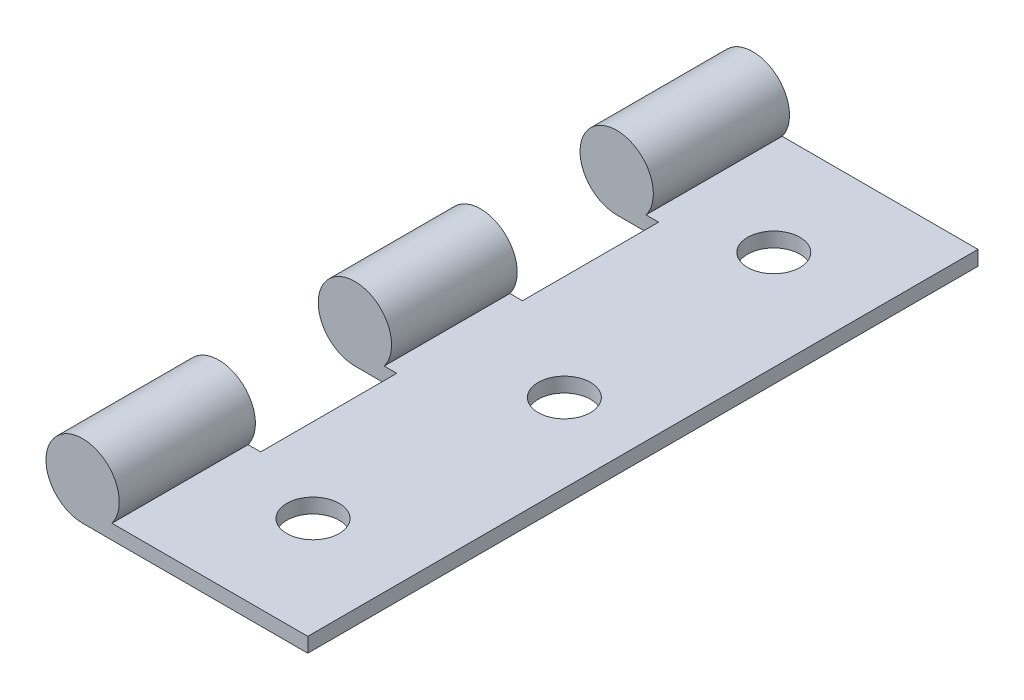
ISO-10303-21;
HEADER;
FILE_DESCRIPTION(('STEP AP214'),'2;1');
FILE_NAME('part.step','',(''),(''),'','','');
FILE_SCHEMA(('AUTOMOTIVE_DESIGN { 1 0 10303 214 1 1 1 1 }'));
ENDSEC;
DATA;
#1=APPLICATION_CONTEXT('core data for automotive mechanical design processes');
#2=APPLICATION_PROTOCOL_DEFINITION('international standard','automotive_design',2000,#1);
#3=PRODUCT_CONTEXT('',#1,'mechanical');
#4=PRODUCT('Part','Part','',(#3));
#5=PRODUCT_RELATED_PRODUCT_CATEGORY('part','',(#4));
#6=PRODUCT_DEFINITION_FORMATION('','',#4);
#7=PRODUCT_DEFINITION_CONTEXT('part definition',#1,'design');
#8=PRODUCT_DEFINITION('design','',#6,#7);
#9=PRODUCT_DEFINITION_SHAPE('','',#8);
#10=(LENGTH_UNIT() NAMED_UNIT(*) SI_UNIT(.MILLI.,.METRE.));
#11=(NAMED_UNIT(*) PLANE_ANGLE_UNIT() SI_UNIT($,.RADIAN.));
#12=(NAMED_UNIT(*) SI_UNIT($,.STERADIAN.) SOLID_ANGLE_UNIT());
#13=UNCERTAINTY_MEASURE_WITH_UNIT(LENGTH_MEASURE(1.E-05),#10,'distance_accuracy_value','');
#14=(GEOMETRIC_REPRESENTATION_CONTEXT(3) GLOBAL_UNCERTAINTY_ASSIGNED_CONTEXT((#13)) GLOBAL_UNIT_ASSIGNED_CONTEXT((#10,
#11,#12)) REPRESENTATION_CONTEXT('',''));
#15=CARTESIAN_POINT('',(0.,0.,0.));
#16=DIRECTION('',(0.,0.,1.));
#17=DIRECTION('',(1.,0.,0.));
#18=AXIS2_PLACEMENT_3D('',#15,#16,#17);
#19=CARTESIAN_POINT('',(0.,0.,64.));
#20=DIRECTION('',(0.,1.,0.));
#21=DIRECTION('',(0.,0.,1.));
#22=AXIS2_PLACEMENT_3D('',#19,#20,#21);
#23=PLANE('',#22);
#24=CARTESIAN_POINT('',(11.999999876,0.,53.99999995));
#25=DIRECTION('',(0.,1.,0.));
#26=DIRECTION('',(0.,0.,1.));
#27=AXIS2_PLACEMENT_3D('',#24,#25,#26);
#28=CIRCLE('',#27,2.49999995299997);
#29=CARTESIAN_POINT('',(11.999999876,0.,51.499999997));
#30=VERTEX_POINT('',#29);
#31=EDGE_CURVE('E173',#30,#30,#28,.T.);
#32=ORIENTED_EDGE('',*,*,#31,.T.);
#33=EDGE_LOOP('',(#32));
#34=FACE_BOUND('',#33,.T.);
#35=CARTESIAN_POINT('',(13.999999876,0.,32.000000008));
#36=DIRECTION('',(0.,1.,0.));
#37=DIRECTION('',(0.,0.,1.));
#38=AXIS2_PLACEMENT_3D('',#35,#36,#37);
#39=CIRCLE('',#38,2.49999995299996);
#40=CARTESIAN_POINT('',(13.999999876,0.,29.500000055));
#41=VERTEX_POINT('',#40);
#42=EDGE_CURVE('E169',#41,#41,#39,.T.);
#43=ORIENTED_EDGE('',*,*,#42,.T.);
#44=EDGE_LOOP('',(#43));
#45=FACE_BOUND('',#44,.T.);
#46=CARTESIAN_POINT('',(11.999999876,0.,10.000000066));
#47=DIRECTION('',(0.,1.,0.));
#48=DIRECTION('',(0.,0.,1.));
#49=AXIS2_PLACEMENT_3D('',#46,#47,#48);
#50=CIRCLE('',#49,2.49999995299997);
#51=CARTESIAN_POINT('',(11.999999876,0.,7.50000011300003));
#52=VERTEX_POINT('',#51);
#53=EDGE_CURVE('E165',#52,#52,#50,.T.);
#54=ORIENTED_EDGE('',*,*,#53,.T.);
#55=EDGE_LOOP('',(#54));
#56=FACE_BOUND('',#55,.T.);
#57=DIRECTION('',(-1.,0.,0.));
#58=VECTOR('',#57,1.);
#59=CARTESIAN_POINT('',(-4.,0.,37.999999908));
#60=LINE('',#59,#58);
#61=CARTESIAN_POINT('',(4.000000002,0.,37.999999908));
#62=VERTEX_POINT('',#61);
#63=CARTESIAN_POINT('',(0.,0.,37.999999908));
#64=VERTEX_POINT('',#63);
#65=EDGE_CURVE('E137',#62,#64,#60,.T.);
#66=ORIENTED_EDGE('',*,*,#65,.T.);
#67=DIRECTION('',(0.,0.,-1.));
#68=VECTOR('',#67,1.);
#69=CARTESIAN_POINT('',(0.,0.,64.));
#70=LINE('',#69,#68);
#71=CARTESIAN_POINT('',(0.,0.,25.999999908));
#72=VERTEX_POINT('',#71);
#73=EDGE_CURVE('E58',#64,#72,#70,.T.);
#74=ORIENTED_EDGE('',*,*,#73,.T.);
#75=DIRECTION('',(1.,0.,0.));
#76=VECTOR('',#75,1.);
#77=CARTESIAN_POINT('',(-4.,0.,25.999999908));
#78=LINE('',#77,#76);
#79=CARTESIAN_POINT('',(4.000000002,0.,25.999999908));
#80=VERTEX_POINT('',#79);
#81=EDGE_CURVE('E155',#72,#80,#78,.T.);
#82=ORIENTED_EDGE('',*,*,#81,.T.);
#83=DIRECTION('',(0.,0.,-1.));
#84=VECTOR('',#83,1.);
#85=CARTESIAN_POINT('',(4.000000002,0.,25.999999908));
#86=LINE('',#85,#84);
#87=CARTESIAN_POINT('',(4.000000002,0.,12.999999908));
#88=VERTEX_POINT('',#87);
#89=EDGE_CURVE('E149',#80,#88,#86,.T.);
#90=ORIENTED_EDGE('',*,*,#89,.T.);
#91=DIRECTION('',(-1.,0.,0.));
#92=VECTOR('',#91,1.);
#93=CARTESIAN_POINT('',(-4.,0.,12.999999908));
#94=LINE('',#93,#92);
#95=CARTESIAN_POINT('',(0.,0.,12.999999908));
#96=VERTEX_POINT('',#95);
#97=EDGE_CURVE('E152',#88,#96,#94,.T.);
#98=ORIENTED_EDGE('',*,*,#97,.T.);
#99=CARTESIAN_POINT('',(0.,0.,0.));
#100=VERTEX_POINT('',#99);
#101=EDGE_CURVE('E207',#96,#100,#70,.T.);
#102=ORIENTED_EDGE('',*,*,#101,.T.);
#103=DIRECTION('',(1.,0.,0.));
#104=VECTOR('',#103,1.);
#105=CARTESIAN_POINT('',(0.,0.,0.));
#106=LINE('',#105,#104);
#107=CARTESIAN_POINT('',(21.499999926,0.,0.));
#108=VERTEX_POINT('',#107);
#109=EDGE_CURVE('E191',#100,#108,#106,.T.);
#110=ORIENTED_EDGE('',*,*,#109,.T.);
#111=DIRECTION('',(0.,0.,-1.));
#112=VECTOR('',#111,1.);
#113=CARTESIAN_POINT('',(21.499999926,0.,64.));
#114=LINE('',#113,#112);
#115=CARTESIAN_POINT('',(21.499999926,0.,64.));
#116=VERTEX_POINT('',#115);
#117=EDGE_CURVE('E204',#116,#108,#114,.T.);
#118=ORIENTED_EDGE('',*,*,#117,.F.);
#119=DIRECTION('',(1.,0.,0.));
#120=VECTOR('',#119,1.);
#121=CARTESIAN_POINT('',(0.,0.,64.));
#122=LINE('',#121,#120);
#123=CARTESIAN_POINT('',(0.,0.,64.));
#124=VERTEX_POINT('',#123);
#125=EDGE_CURVE('E180',#124,#116,#122,.T.);
#126=ORIENTED_EDGE('',*,*,#125,.F.);
#127=CARTESIAN_POINT('',(0.,0.,50.999999908));
#128=VERTEX_POINT('',#127);
#129=EDGE_CURVE('E208',#124,#128,#70,.T.);
#130=ORIENTED_EDGE('',*,*,#129,.T.);
#131=DIRECTION('',(1.,0.,0.));
#132=VECTOR('',#131,1.);
#133=CARTESIAN_POINT('',(-4.,0.,50.999999908));
#134=LINE('',#133,#132);
#135=CARTESIAN_POINT('',(4.000000002,0.,50.999999908));
#136=VERTEX_POINT('',#135);
#137=EDGE_CURVE('E50',#128,#136,#134,.T.);
#138=ORIENTED_EDGE('',*,*,#137,.T.);
#139=DIRECTION('',(0.,0.,-1.));
#140=VECTOR('',#139,1.);
#141=CARTESIAN_POINT('',(4.000000002,0.,37.999999908));
#142=LINE('',#141,#140);
#143=EDGE_CURVE('E130',#136,#62,#142,.T.);
#144=ORIENTED_EDGE('',*,*,#143,.T.);
#145=EDGE_LOOP('',(#66,#74,#82,#90,#98,#102,#110,#118,#126,#130,#138,#144));
#146=FACE_BOUND('',#145,.T.);
#147=ADVANCED_FACE('F35',(#34,#45,#56,#146),#23,.F.);
#148=CARTESIAN_POINT('',(2.7999999925,1.4,64.));
#149=DIRECTION('',(0.,-1.,0.));
#150=DIRECTION('',(1.,0.,0.));
#151=AXIS2_PLACEMENT_3D('',#148,#149,#150);
#152=PLANE('',#151);
#153=CARTESIAN_POINT('',(11.999999876,1.4,53.99999995));
#154=DIRECTION('',(0.,-1.,0.));
#155=DIRECTION('',(1.,0.,0.));
#156=AXIS2_PLACEMENT_3D('',#153,#154,#155);
#157=CIRCLE('',#156,2.49999995299997);
#158=CARTESIAN_POINT('',(11.999999876,1.4,51.499999997));
#159=VERTEX_POINT('',#158);
#160=EDGE_CURVE('E176',#159,#159,#157,.F.);
#161=ORIENTED_EDGE('',*,*,#160,.F.);
#162=EDGE_LOOP('',(#161));
#163=FACE_BOUND('',#162,.T.);
#164=CARTESIAN_POINT('',(13.999999876,1.4,32.000000008));
#165=DIRECTION('',(0.,-1.,0.));
#166=DIRECTION('',(1.,0.,0.));
#167=AXIS2_PLACEMENT_3D('',#164,#165,#166);
#168=CIRCLE('',#167,2.49999995299996);
#169=CARTESIAN_POINT('',(13.999999876,1.4,29.500000055));
#170=VERTEX_POINT('',#169);
#171=EDGE_CURVE('E172',#170,#170,#168,.F.);
#172=ORIENTED_EDGE('',*,*,#171,.F.);
#173=EDGE_LOOP('',(#172));
#174=FACE_BOUND('',#173,.T.);
#175=CARTESIAN_POINT('',(11.999999876,1.4,10.000000066));
#176=DIRECTION('',(0.,-1.,0.));
#177=DIRECTION('',(1.,0.,0.));
#178=AXIS2_PLACEMENT_3D('',#175,#176,#177);
#179=CIRCLE('',#178,2.49999995299997);
#180=CARTESIAN_POINT('',(11.999999876,1.4,7.50000011300003));
#181=VERTEX_POINT('',#180);
#182=EDGE_CURVE('E168',#181,#181,#179,.F.);
#183=ORIENTED_EDGE('',*,*,#182,.F.);
#184=EDGE_LOOP('',(#183));
#185=FACE_BOUND('',#184,.T.);
#186=DIRECTION('',(-1.,0.,0.));
#187=VECTOR('',#186,1.);
#188=CARTESIAN_POINT('',(2.7999999925,1.4,37.999999908));
#189=LINE('',#188,#187);
#190=CARTESIAN_POINT('',(4.000000002,1.4,37.999999908));
#191=VERTEX_POINT('',#190);
#192=CARTESIAN_POINT('',(2.7999999925,1.4,37.999999908));
#193=VERTEX_POINT('',#192);
#194=EDGE_CURVE('E147',#191,#193,#189,.T.);
#195=ORIENTED_EDGE('',*,*,#194,.F.);
#196=DIRECTION('',(0.,0.,-1.));
#197=VECTOR('',#196,1.);
#198=CARTESIAN_POINT('',(4.000000002,1.4,64.));
#199=LINE('',#198,#197);
#200=CARTESIAN_POINT('',(4.000000002,1.4,50.999999908));
#201=VERTEX_POINT('',#200);
#202=EDGE_CURVE('E11',#201,#191,#199,.T.);
#203=ORIENTED_EDGE('',*,*,#202,.F.);
#204=DIRECTION('',(1.,0.,0.));
#205=VECTOR('',#204,1.);
#206=CARTESIAN_POINT('',(2.79999999250001,1.4,50.999999908));
#207=LINE('',#206,#205);
#208=CARTESIAN_POINT('',(2.7999999925,1.4,50.999999908));
#209=VERTEX_POINT('',#208);
#210=EDGE_CURVE('E134',#209,#201,#207,.T.);
#211=ORIENTED_EDGE('',*,*,#210,.F.);
#212=DIRECTION('',(0.,0.,-1.));
#213=VECTOR('',#212,1.);
#214=CARTESIAN_POINT('',(2.7999999925,1.4,64.));
#215=LINE('',#214,#213);
#216=CARTESIAN_POINT('',(2.7999999925,1.4,64.));
#217=VERTEX_POINT('',#216);
#218=EDGE_CURVE('E197',#217,#209,#215,.T.);
#219=ORIENTED_EDGE('',*,*,#218,.F.);
#220=DIRECTION('',(-1.,0.,0.));
#221=VECTOR('',#220,1.);
#222=CARTESIAN_POINT('',(2.7999999925,1.4,64.));
#223=LINE('',#222,#221);
#224=CARTESIAN_POINT('',(21.499999926,1.4,64.));
#225=VERTEX_POINT('',#224);
#226=EDGE_CURVE('E185',#225,#217,#223,.T.);
#227=ORIENTED_EDGE('',*,*,#226,.F.);
#228=DIRECTION('',(0.,0.,-1.));
#229=VECTOR('',#228,1.);
#230=CARTESIAN_POINT('',(21.499999926,1.4,64.));
#231=LINE('',#230,#229);
#232=CARTESIAN_POINT('',(21.499999926,1.4,0.));
#233=VERTEX_POINT('',#232);
#234=EDGE_CURVE('E200',#225,#233,#231,.T.);
#235=ORIENTED_EDGE('',*,*,#234,.T.);
#236=DIRECTION('',(-1.,0.,0.));
#237=VECTOR('',#236,1.);
#238=CARTESIAN_POINT('',(2.7999999925,1.4,0.));
#239=LINE('',#238,#237);
#240=CARTESIAN_POINT('',(2.7999999925,1.4,0.));
#241=VERTEX_POINT('',#240);
#242=EDGE_CURVE('E181',#233,#241,#239,.T.);
#243=ORIENTED_EDGE('',*,*,#242,.T.);
#244=CARTESIAN_POINT('',(2.7999999925,1.4,12.999999908));
#245=VERTEX_POINT('',#244);
#246=EDGE_CURVE('E187',#245,#241,#215,.T.);
#247=ORIENTED_EDGE('',*,*,#246,.F.);
#248=DIRECTION('',(-1.,0.,0.));
#249=VECTOR('',#248,1.);
#250=CARTESIAN_POINT('',(2.7999999925,1.4,12.999999908));
#251=LINE('',#250,#249);
#252=CARTESIAN_POINT('',(4.000000002,1.4,12.999999908));
#253=VERTEX_POINT('',#252);
#254=EDGE_CURVE('E163',#253,#245,#251,.T.);
#255=ORIENTED_EDGE('',*,*,#254,.F.);
#256=DIRECTION('',(0.,0.,-1.));
#257=VECTOR('',#256,1.);
#258=CARTESIAN_POINT('',(4.000000002,1.4,64.));
#259=LINE('',#258,#257);
#260=CARTESIAN_POINT('',(4.000000002,1.4,25.999999908));
#261=VERTEX_POINT('',#260);
#262=EDGE_CURVE('E221',#261,#253,#259,.T.);
#263=ORIENTED_EDGE('',*,*,#262,.F.);
#264=DIRECTION('',(1.,0.,0.));
#265=VECTOR('',#264,1.);
#266=CARTESIAN_POINT('',(2.7999999925,1.4,25.999999908));
#267=LINE('',#266,#265);
#268=CARTESIAN_POINT('',(2.7999999925,1.4,25.999999908));
#269=VERTEX_POINT('',#268);
#270=EDGE_CURVE('E161',#269,#261,#267,.T.);
#271=ORIENTED_EDGE('',*,*,#270,.F.);
#272=EDGE_CURVE('E201',#193,#269,#215,.T.);
#273=ORIENTED_EDGE('',*,*,#272,.F.);
#274=EDGE_LOOP('',(#195,#203,#211,#219,#227,#235,#243,#247,#255,#263,#271,#273));
#275=FACE_BOUND('',#274,.T.);
#276=ADVANCED_FACE('F230',(#163,#174,#185,#275),#152,.F.);
#277=CARTESIAN_POINT('',(0.,3.499999985,64.));
#278=DIRECTION('',(0.,0.,-1.));
#279=DIRECTION('',(-1.,0.,0.));
#280=AXIS2_PLACEMENT_3D('',#277,#278,#279);
#281=CYLINDRICAL_SURFACE('',#280,3.499999985);
#282=CARTESIAN_POINT('',(0.,3.499999985,37.999999908));
#283=DIRECTION('',(0.,0.,1.));
#284=DIRECTION('',(1.,0.,0.));
#285=AXIS2_PLACEMENT_3D('',#282,#283,#284);
#286=CIRCLE('',#285,3.499999985);
#287=EDGE_CURVE('E43',#193,#64,#286,.T.);
#288=ORIENTED_EDGE('',*,*,#287,.F.);
#289=ORIENTED_EDGE('',*,*,#272,.T.);
#290=CARTESIAN_POINT('',(0.,3.499999985,25.999999908));
#291=DIRECTION('',(0.,0.,-1.));
#292=DIRECTION('',(-1.,0.,0.));
#293=AXIS2_PLACEMENT_3D('',#290,#291,#292);
#294=CIRCLE('',#293,3.499999985);
#295=EDGE_CURVE('E210',#72,#269,#294,.T.);
#296=ORIENTED_EDGE('',*,*,#295,.F.);
#297=ORIENTED_EDGE('',*,*,#73,.F.);
#298=EDGE_LOOP('',(#288,#289,#296,#297));
#299=FACE_BOUND('',#298,.T.);
#300=ADVANCED_FACE('F254',(#299),#281,.T.);
#301=CARTESIAN_POINT('',(0.,3.499999985,50.999999908));
#302=DIRECTION('',(0.,0.,-1.));
#303=DIRECTION('',(-1.,0.,0.));
#304=AXIS2_PLACEMENT_3D('',#301,#302,#303);
#305=CIRCLE('',#304,3.499999985);
#306=EDGE_CURVE('E223',#128,#209,#305,.T.);
#307=ORIENTED_EDGE('',*,*,#306,.F.);
#308=ORIENTED_EDGE('',*,*,#129,.F.);
#309=CARTESIAN_POINT('',(0.,3.499999985,64.));
#310=DIRECTION('',(0.,0.,1.));
#311=DIRECTION('',(1.,0.,0.));
#312=AXIS2_PLACEMENT_3D('',#309,#310,#311);
#313=CIRCLE('',#312,3.499999985);
#314=EDGE_CURVE('E177',#217,#124,#313,.T.);
#315=ORIENTED_EDGE('',*,*,#314,.F.);
#316=ORIENTED_EDGE('',*,*,#218,.T.);
#317=EDGE_LOOP('',(#307,#308,#315,#316));
#318=FACE_BOUND('',#317,.T.);
#319=ADVANCED_FACE('F233',(#318),#281,.T.);
#320=CARTESIAN_POINT('',(0.,3.499999985,12.999999908));
#321=DIRECTION('',(0.,0.,1.));
#322=DIRECTION('',(1.,0.,0.));
#323=AXIS2_PLACEMENT_3D('',#320,#321,#322);
#324=CIRCLE('',#323,3.499999985);
#325=EDGE_CURVE('E219',#245,#96,#324,.T.);
#326=ORIENTED_EDGE('',*,*,#325,.F.);
#327=ORIENTED_EDGE('',*,*,#246,.T.);
#328=CARTESIAN_POINT('',(0.,3.499999985,0.));
#329=DIRECTION('',(0.,0.,1.));
#330=DIRECTION('',(1.,0.,0.));
#331=AXIS2_PLACEMENT_3D('',#328,#329,#330);
#332=CIRCLE('',#331,3.499999985);
#333=EDGE_CURVE('E188',#241,#100,#332,.T.);
#334=ORIENTED_EDGE('',*,*,#333,.T.);
#335=ORIENTED_EDGE('',*,*,#101,.F.);
#336=EDGE_LOOP('',(#326,#327,#334,#335));
#337=FACE_BOUND('',#336,.T.);
#338=ADVANCED_FACE('F37',(#337),#281,.T.);
#339=CARTESIAN_POINT('',(21.499999926,0.,64.));
#340=DIRECTION('',(-1.,0.,0.));
#341=DIRECTION('',(0.,0.,1.));
#342=AXIS2_PLACEMENT_3D('',#339,#340,#341);
#343=PLANE('',#342);
#344=DIRECTION('',(0.,1.,0.));
#345=VECTOR('',#344,1.);
#346=CARTESIAN_POINT('',(21.499999926,0.,0.));
#347=LINE('',#346,#345);
#348=EDGE_CURVE('E193',#108,#233,#347,.T.);
#349=ORIENTED_EDGE('',*,*,#348,.T.);
#350=ORIENTED_EDGE('',*,*,#234,.F.);
#351=DIRECTION('',(0.,1.,0.));
#352=VECTOR('',#351,1.);
#353=CARTESIAN_POINT('',(21.499999926,0.,64.));
#354=LINE('',#353,#352);
#355=EDGE_CURVE('E183',#116,#225,#354,.T.);
#356=ORIENTED_EDGE('',*,*,#355,.F.);
#357=ORIENTED_EDGE('',*,*,#117,.T.);
#358=EDGE_LOOP('',(#349,#350,#356,#357));
#359=FACE_BOUND('',#358,.T.);
#360=ADVANCED_FACE('F267',(#359),#343,.F.);
#361=CARTESIAN_POINT('',(0.,3.499999985,64.));
#362=DIRECTION('',(0.,0.,1.));
#363=DIRECTION('',(1.,0.,0.));
#364=AXIS2_PLACEMENT_3D('',#361,#362,#363);
#365=PLANE('',#364);
#366=ORIENTED_EDGE('',*,*,#314,.T.);
#367=ORIENTED_EDGE('',*,*,#125,.T.);
#368=ORIENTED_EDGE('',*,*,#355,.T.);
#369=ORIENTED_EDGE('',*,*,#226,.T.);
#370=EDGE_LOOP('',(#366,#367,#368,#369));
#371=FACE_BOUND('',#370,.T.);
#372=ADVANCED_FACE('F235',(#371),#365,.T.);
#373=CARTESIAN_POINT('',(0.,3.499999985,0.));
#374=DIRECTION('',(0.,0.,1.));
#375=DIRECTION('',(1.,0.,0.));
#376=AXIS2_PLACEMENT_3D('',#373,#374,#375);
#377=PLANE('',#376);
#378=ORIENTED_EDGE('',*,*,#333,.F.);
#379=ORIENTED_EDGE('',*,*,#242,.F.);
#380=ORIENTED_EDGE('',*,*,#348,.F.);
#381=ORIENTED_EDGE('',*,*,#109,.F.);
#382=EDGE_LOOP('',(#378,#379,#380,#381));
#383=FACE_BOUND('',#382,.T.);
#384=ADVANCED_FACE('F245',(#383),#377,.F.);
#385=CARTESIAN_POINT('',(11.999999876,4.99999999999999,53.99999995));
#386=DIRECTION('',(0.,-1.,0.));
#387=DIRECTION('',(0.,0.,-1.));
#388=AXIS2_PLACEMENT_3D('',#385,#386,#387);
#389=CYLINDRICAL_SURFACE('',#388,2.49999995299997);
#390=CARTESIAN_POINT('',(11.999999876,0.,51.499999997));
#391=CARTESIAN_POINT('',(11.999999876,0.0145833333333326,51.499999997));
#392=CARTESIAN_POINT('',(11.999999876,0.0291666666666661,51.499999997));
#393=CARTESIAN_POINT('',(11.999999876,0.0583333333333327,51.499999997));
#394=CARTESIAN_POINT('',(11.999999876,0.0729166666666659,51.499999997));
#395=CARTESIAN_POINT('',(11.999999876,0.102083333333332,51.499999997));
#396=CARTESIAN_POINT('',(11.999999876,0.116666666666666,51.499999997));
#397=CARTESIAN_POINT('',(11.999999876,0.145833333333333,51.499999997));
#398=CARTESIAN_POINT('',(11.999999876,0.160416666666666,51.499999997));
#399=CARTESIAN_POINT('',(11.999999876,0.189583333333332,51.499999997));
#400=CARTESIAN_POINT('',(11.999999876,0.204166666666666,51.499999997));
#401=CARTESIAN_POINT('',(11.999999876,0.233333333333333,51.499999997));
#402=CARTESIAN_POINT('',(11.999999876,0.247916666666666,51.499999997));
#403=CARTESIAN_POINT('',(11.999999876,0.277083333333333,51.499999997));
#404=CARTESIAN_POINT('',(11.999999876,0.291666666666666,51.499999997));
#405=CARTESIAN_POINT('',(11.999999876,0.320833333333333,51.499999997));
#406=CARTESIAN_POINT('',(11.999999876,0.335416666666666,51.499999997));
#407=CARTESIAN_POINT('',(11.999999876,0.364583333333333,51.499999997));
#408=CARTESIAN_POINT('',(11.999999876,0.379166666666667,51.499999997));
#409=CARTESIAN_POINT('',(11.999999876,0.408333333333333,51.499999997));
#410=CARTESIAN_POINT('',(11.999999876,0.422916666666666,51.499999997));
#411=CARTESIAN_POINT('',(11.999999876,0.452083333333333,51.499999997));
#412=CARTESIAN_POINT('',(11.999999876,0.466666666666666,51.499999997));
#413=CARTESIAN_POINT('',(11.999999876,0.495833333333333,51.499999997));
#414=CARTESIAN_POINT('',(11.999999876,0.510416666666667,51.499999997));
#415=CARTESIAN_POINT('',(11.999999876,0.539583333333333,51.499999997));
#416=CARTESIAN_POINT('',(11.999999876,0.554166666666667,51.499999997));
#417=CARTESIAN_POINT('',(11.999999876,0.583333333333333,51.499999997));
#418=CARTESIAN_POINT('',(11.999999876,0.597916666666667,51.499999997));
#419=CARTESIAN_POINT('',(11.999999876,0.627083333333333,51.499999997));
#420=CARTESIAN_POINT('',(11.999999876,0.641666666666667,51.499999997));
#421=CARTESIAN_POINT('',(11.999999876,0.670833333333333,51.499999997));
#422=CARTESIAN_POINT('',(11.999999876,0.685416666666667,51.499999997));
#423=CARTESIAN_POINT('',(11.999999876,0.714583333333334,51.499999997));
#424=CARTESIAN_POINT('',(11.999999876,0.729166666666667,51.499999997));
#425=CARTESIAN_POINT('',(11.999999876,0.758333333333334,51.499999997));
#426=CARTESIAN_POINT('',(11.999999876,0.772916666666667,51.499999997));
#427=CARTESIAN_POINT('',(11.999999876,0.802083333333333,51.499999997));
#428=CARTESIAN_POINT('',(11.999999876,0.816666666666667,51.499999997));
#429=CARTESIAN_POINT('',(11.999999876,0.845833333333334,51.499999997));
#430=CARTESIAN_POINT('',(11.999999876,0.860416666666667,51.499999997));
#431=CARTESIAN_POINT('',(11.999999876,0.889583333333333,51.499999997));
#432=CARTESIAN_POINT('',(11.999999876,0.904166666666667,51.499999997));
#433=CARTESIAN_POINT('',(11.999999876,0.933333333333334,51.499999997));
#434=CARTESIAN_POINT('',(11.999999876,0.947916666666667,51.499999997));
#435=CARTESIAN_POINT('',(11.999999876,0.977083333333334,51.499999997));
#436=CARTESIAN_POINT('',(11.999999876,0.991666666666668,51.499999997));
#437=CARTESIAN_POINT('',(11.999999876,1.02083333333333,51.499999997));
#438=CARTESIAN_POINT('',(11.999999876,1.03541666666667,51.499999997));
#439=CARTESIAN_POINT('',(11.999999876,1.06458333333333,51.499999997));
#440=CARTESIAN_POINT('',(11.999999876,1.07916666666667,51.499999997));
#441=CARTESIAN_POINT('',(11.999999876,1.10833333333333,51.499999997));
#442=CARTESIAN_POINT('',(11.999999876,1.12291666666667,51.499999997));
#443=CARTESIAN_POINT('',(11.999999876,1.15208333333333,51.499999997));
#444=CARTESIAN_POINT('',(11.999999876,1.16666666666667,51.499999997));
#445=CARTESIAN_POINT('',(11.999999876,1.19583333333333,51.499999997));
#446=CARTESIAN_POINT('',(11.999999876,1.21041666666667,51.499999997));
#447=CARTESIAN_POINT('',(11.999999876,1.23958333333333,51.499999997));
#448=CARTESIAN_POINT('',(11.999999876,1.25416666666667,51.499999997));
#449=CARTESIAN_POINT('',(11.999999876,1.28333333333333,51.499999997));
#450=CARTESIAN_POINT('',(11.999999876,1.29791666666667,51.499999997));
#451=CARTESIAN_POINT('',(11.999999876,1.32708333333333,51.499999997));
#452=CARTESIAN_POINT('',(11.999999876,1.34166666666667,51.499999997));
#453=CARTESIAN_POINT('',(11.999999876,1.37083333333333,51.499999997));
#454=CARTESIAN_POINT('',(11.999999876,1.38541666666667,51.499999997));
#455=CARTESIAN_POINT('',(11.999999876,1.4,51.499999997));
#456=B_SPLINE_CURVE_WITH_KNOTS('',3,(#390,#391,#392,#393,#394,#395,#396,#397,#398,#399,#400,
#401,#402,#403,#404,#405,#406,#407,#408,#409,#410,#411,#412,#413,#414,#415,#416,#417,#418,#419,
#420,#421,#422,#423,#424,#425,#426,#427,#428,#429,#430,#431,#432,#433,#434,#435,#436,#437,#438,
#439,#440,#441,#442,#443,#444,#445,#446,#447,#448,#449,#450,#451,#452,#453,#454,#455),
.UNSPECIFIED.,.F.,.F.,(4,2,2,2,2,2,2,2,2,2,2,2,2,2,2,2,2,2,2,2,2,2,2,2,2,2,2,2,2,2,2,2,4),(0.,
0.0437500000000004,0.0874999999999999,0.13125,0.175,0.21875,0.262500000000001,0.30625,0.35,
0.393750000000001,0.4375,0.481250000000001,0.525000000000001,0.568750000000001,
0.612500000000001,0.656250000000001,0.700000000000001,0.743750000000001,0.787500000000001,
0.831250000000001,0.875000000000001,0.918750000000001,0.962500000000002,1.00625,1.05,1.09375,
1.1375,1.18125,1.225,1.26875,1.3125,1.35625,1.4),.UNSPECIFIED.);
#457=EDGE_CURVE('BSEAM300',#30,#159,#456,.T.);
#458=ORIENTED_EDGE('',*,*,#31,.F.);
#459=ORIENTED_EDGE('',*,*,#160,.T.);
#460=ORIENTED_EDGE('',*,*,#457,.T.);
#461=ORIENTED_EDGE('',*,*,#457,.F.);
#462=EDGE_LOOP('',(#458,#460,#459,#461));
#463=FACE_BOUND('',#462,.T.);
#464=ADVANCED_FACE('F300',(#463),#389,.F.);
#465=CARTESIAN_POINT('',(13.999999876,4.99999999999999,32.000000008));
#466=DIRECTION('',(0.,-1.,0.));
#467=DIRECTION('',(0.,0.,-1.));
#468=AXIS2_PLACEMENT_3D('',#465,#466,#467);
#469=CYLINDRICAL_SURFACE('',#468,2.49999995299996);
#470=CARTESIAN_POINT('',(13.999999876,0.,29.500000055));
#471=CARTESIAN_POINT('',(13.999999876,0.0145833333333326,29.500000055));
#472=CARTESIAN_POINT('',(13.999999876,0.0291666666666661,29.500000055));
#473=CARTESIAN_POINT('',(13.999999876,0.0583333333333327,29.500000055));
#474=CARTESIAN_POINT('',(13.999999876,0.0729166666666659,29.500000055));
#475=CARTESIAN_POINT('',(13.999999876,0.102083333333332,29.500000055));
#476=CARTESIAN_POINT('',(13.999999876,0.116666666666666,29.500000055));
#477=CARTESIAN_POINT('',(13.999999876,0.145833333333333,29.500000055));
#478=CARTESIAN_POINT('',(13.999999876,0.160416666666666,29.500000055));
#479=CARTESIAN_POINT('',(13.999999876,0.189583333333332,29.500000055));
#480=CARTESIAN_POINT('',(13.999999876,0.204166666666666,29.500000055));
#481=CARTESIAN_POINT('',(13.999999876,0.233333333333333,29.500000055));
#482=CARTESIAN_POINT('',(13.999999876,0.247916666666666,29.500000055));
#483=CARTESIAN_POINT('',(13.999999876,0.277083333333333,29.500000055));
#484=CARTESIAN_POINT('',(13.999999876,0.291666666666666,29.500000055));
#485=CARTESIAN_POINT('',(13.999999876,0.320833333333333,29.500000055));
#486=CARTESIAN_POINT('',(13.999999876,0.335416666666666,29.500000055));
#487=CARTESIAN_POINT('',(13.999999876,0.364583333333333,29.500000055));
#488=CARTESIAN_POINT('',(13.999999876,0.379166666666667,29.500000055));
#489=CARTESIAN_POINT('',(13.999999876,0.408333333333333,29.500000055));
#490=CARTESIAN_POINT('',(13.999999876,0.422916666666666,29.500000055));
#491=CARTESIAN_POINT('',(13.999999876,0.452083333333333,29.500000055));
#492=CARTESIAN_POINT('',(13.999999876,0.466666666666666,29.500000055));
#493=CARTESIAN_POINT('',(13.999999876,0.495833333333333,29.500000055));
#494=CARTESIAN_POINT('',(13.999999876,0.510416666666667,29.500000055));
#495=CARTESIAN_POINT('',(13.999999876,0.539583333333333,29.500000055));
#496=CARTESIAN_POINT('',(13.999999876,0.554166666666667,29.500000055));
#497=CARTESIAN_POINT('',(13.999999876,0.583333333333333,29.500000055));
#498=CARTESIAN_POINT('',(13.999999876,0.597916666666667,29.500000055));
#499=CARTESIAN_POINT('',(13.999999876,0.627083333333333,29.500000055));
#500=CARTESIAN_POINT('',(13.999999876,0.641666666666667,29.500000055));
#501=CARTESIAN_POINT('',(13.999999876,0.670833333333333,29.500000055));
#502=CARTESIAN_POINT('',(13.999999876,0.685416666666667,29.500000055));
#503=CARTESIAN_POINT('',(13.999999876,0.714583333333334,29.500000055));
#504=CARTESIAN_POINT('',(13.999999876,0.729166666666667,29.500000055));
#505=CARTESIAN_POINT('',(13.999999876,0.758333333333334,29.500000055));
#506=CARTESIAN_POINT('',(13.999999876,0.772916666666667,29.500000055));
#507=CARTESIAN_POINT('',(13.999999876,0.802083333333333,29.500000055));
#508=CARTESIAN_POINT('',(13.999999876,0.816666666666667,29.500000055));
#509=CARTESIAN_POINT('',(13.999999876,0.845833333333334,29.500000055));
#510=CARTESIAN_POINT('',(13.999999876,0.860416666666667,29.500000055));
#511=CARTESIAN_POINT('',(13.999999876,0.889583333333333,29.500000055));
#512=CARTESIAN_POINT('',(13.999999876,0.904166666666667,29.500000055));
#513=CARTESIAN_POINT('',(13.999999876,0.933333333333334,29.500000055));
#514=CARTESIAN_POINT('',(13.999999876,0.947916666666667,29.500000055));
#515=CARTESIAN_POINT('',(13.999999876,0.977083333333334,29.500000055));
#516=CARTESIAN_POINT('',(13.999999876,0.991666666666668,29.500000055));
#517=CARTESIAN_POINT('',(13.999999876,1.02083333333333,29.500000055));
#518=CARTESIAN_POINT('',(13.999999876,1.03541666666667,29.500000055));
#519=CARTESIAN_POINT('',(13.999999876,1.06458333333333,29.500000055));
#520=CARTESIAN_POINT('',(13.999999876,1.07916666666667,29.500000055));
#521=CARTESIAN_POINT('',(13.999999876,1.10833333333333,29.500000055));
#522=CARTESIAN_POINT('',(13.999999876,1.12291666666667,29.500000055));
#523=CARTESIAN_POINT('',(13.999999876,1.15208333333333,29.500000055));
#524=CARTESIAN_POINT('',(13.999999876,1.16666666666667,29.500000055));
#525=CARTESIAN_POINT('',(13.999999876,1.19583333333333,29.500000055));
#526=CARTESIAN_POINT('',(13.999999876,1.21041666666667,29.500000055));
#527=CARTESIAN_POINT('',(13.999999876,1.23958333333333,29.500000055));
#528=CARTESIAN_POINT('',(13.999999876,1.25416666666667,29.500000055));
#529=CARTESIAN_POINT('',(13.999999876,1.28333333333333,29.500000055));
#530=CARTESIAN_POINT('',(13.999999876,1.29791666666667,29.500000055));
#531=CARTESIAN_POINT('',(13.999999876,1.32708333333333,29.500000055));
#532=CARTESIAN_POINT('',(13.999999876,1.34166666666667,29.500000055));
#533=CARTESIAN_POINT('',(13.999999876,1.37083333333333,29.500000055));
#534=CARTESIAN_POINT('',(13.999999876,1.38541666666667,29.500000055));
#535=CARTESIAN_POINT('',(13.999999876,1.4,29.500000055));
#536=B_SPLINE_CURVE_WITH_KNOTS('',3,(#470,#471,#472,#473,#474,#475,#476,#477,#478,#479,#480,
#481,#482,#483,#484,#485,#486,#487,#488,#489,#490,#491,#492,#493,#494,#495,#496,#497,#498,#499,
#500,#501,#502,#503,#504,#505,#506,#507,#508,#509,#510,#511,#512,#513,#514,#515,#516,#517,#518,
#519,#520,#521,#522,#523,#524,#525,#526,#527,#528,#529,#530,#531,#532,#533,#534,#535),
.UNSPECIFIED.,.F.,.F.,(4,2,2,2,2,2,2,2,2,2,2,2,2,2,2,2,2,2,2,2,2,2,2,2,2,2,2,2,2,2,2,2,4),(0.,
0.0437500000000004,0.0874999999999999,0.13125,0.175,0.21875,0.262500000000001,0.30625,0.35,
0.393750000000001,0.4375,0.481250000000001,0.525000000000001,0.568750000000001,
0.612500000000001,0.656250000000001,0.700000000000001,0.743750000000001,0.787500000000001,
0.831250000000001,0.875000000000001,0.918750000000001,0.962500000000002,1.00625,1.05,1.09375,
1.1375,1.18125,1.225,1.26875,1.3125,1.35625,1.4),.UNSPECIFIED.);
#537=EDGE_CURVE('BSEAM291',#41,#170,#536,.T.);
#538=ORIENTED_EDGE('',*,*,#42,.F.);
#539=ORIENTED_EDGE('',*,*,#171,.T.);
#540=ORIENTED_EDGE('',*,*,#537,.T.);
#541=ORIENTED_EDGE('',*,*,#537,.F.);
#542=EDGE_LOOP('',(#538,#540,#539,#541));
#543=FACE_BOUND('',#542,.T.);
#544=ADVANCED_FACE('F291',(#543),#469,.F.);
#545=CARTESIAN_POINT('',(11.999999876,4.99999999999999,10.000000066));
#546=DIRECTION('',(0.,-1.,0.));
#547=DIRECTION('',(0.,0.,-1.));
#548=AXIS2_PLACEMENT_3D('',#545,#546,#547);
#549=CYLINDRICAL_SURFACE('',#548,2.49999995299997);
#550=CARTESIAN_POINT('',(11.999999876,0.,7.50000011300003));
#551=CARTESIAN_POINT('',(11.999999876,0.0145833333333326,7.50000011300003));
#552=CARTESIAN_POINT('',(11.999999876,0.0291666666666661,7.50000011300003));
#553=CARTESIAN_POINT('',(11.999999876,0.0583333333333327,7.50000011300003));
#554=CARTESIAN_POINT('',(11.999999876,0.0729166666666659,7.50000011300003));
#555=CARTESIAN_POINT('',(11.999999876,0.102083333333332,7.50000011300003));
#556=CARTESIAN_POINT('',(11.999999876,0.116666666666666,7.50000011300003));
#557=CARTESIAN_POINT('',(11.999999876,0.145833333333333,7.50000011300003));
#558=CARTESIAN_POINT('',(11.999999876,0.160416666666666,7.50000011300003));
#559=CARTESIAN_POINT('',(11.999999876,0.189583333333332,7.50000011300003));
#560=CARTESIAN_POINT('',(11.999999876,0.204166666666666,7.50000011300003));
#561=CARTESIAN_POINT('',(11.999999876,0.233333333333333,7.50000011300003));
#562=CARTESIAN_POINT('',(11.999999876,0.247916666666666,7.50000011300003));
#563=CARTESIAN_POINT('',(11.999999876,0.277083333333333,7.50000011300003));
#564=CARTESIAN_POINT('',(11.999999876,0.291666666666666,7.50000011300003));
#565=CARTESIAN_POINT('',(11.999999876,0.320833333333333,7.50000011300003));
#566=CARTESIAN_POINT('',(11.999999876,0.335416666666666,7.50000011300003));
#567=CARTESIAN_POINT('',(11.999999876,0.364583333333333,7.50000011300003));
#568=CARTESIAN_POINT('',(11.999999876,0.379166666666667,7.50000011300003));
#569=CARTESIAN_POINT('',(11.999999876,0.408333333333333,7.50000011300003));
#570=CARTESIAN_POINT('',(11.999999876,0.422916666666666,7.50000011300003));
#571=CARTESIAN_POINT('',(11.999999876,0.452083333333333,7.50000011300003));
#572=CARTESIAN_POINT('',(11.999999876,0.466666666666666,7.50000011300003));
#573=CARTESIAN_POINT('',(11.999999876,0.495833333333333,7.50000011300003));
#574=CARTESIAN_POINT('',(11.999999876,0.510416666666667,7.50000011300003));
#575=CARTESIAN_POINT('',(11.999999876,0.539583333333333,7.50000011300003));
#576=CARTESIAN_POINT('',(11.999999876,0.554166666666667,7.50000011300003));
#577=CARTESIAN_POINT('',(11.999999876,0.583333333333333,7.50000011300003));
#578=CARTESIAN_POINT('',(11.999999876,0.597916666666667,7.50000011300003));
#579=CARTESIAN_POINT('',(11.999999876,0.627083333333333,7.50000011300003));
#580=CARTESIAN_POINT('',(11.999999876,0.641666666666667,7.50000011300003));
#581=CARTESIAN_POINT('',(11.999999876,0.670833333333333,7.50000011300003));
#582=CARTESIAN_POINT('',(11.999999876,0.685416666666667,7.50000011300003));
#583=CARTESIAN_POINT('',(11.999999876,0.714583333333334,7.50000011300003));
#584=CARTESIAN_POINT('',(11.999999876,0.729166666666667,7.50000011300003));
#585=CARTESIAN_POINT('',(11.999999876,0.758333333333334,7.50000011300003));
#586=CARTESIAN_POINT('',(11.999999876,0.772916666666667,7.50000011300003));
#587=CARTESIAN_POINT('',(11.999999876,0.802083333333333,7.50000011300003));
#588=CARTESIAN_POINT('',(11.999999876,0.816666666666667,7.50000011300003));
#589=CARTESIAN_POINT('',(11.999999876,0.845833333333334,7.50000011300003));
#590=CARTESIAN_POINT('',(11.999999876,0.860416666666667,7.50000011300003));
#591=CARTESIAN_POINT('',(11.999999876,0.889583333333333,7.50000011300003));
#592=CARTESIAN_POINT('',(11.999999876,0.904166666666667,7.50000011300003));
#593=CARTESIAN_POINT('',(11.999999876,0.933333333333334,7.50000011300003));
#594=CARTESIAN_POINT('',(11.999999876,0.947916666666667,7.50000011300003));
#595=CARTESIAN_POINT('',(11.999999876,0.977083333333334,7.50000011300003));
#596=CARTESIAN_POINT('',(11.999999876,0.991666666666668,7.50000011300003));
#597=CARTESIAN_POINT('',(11.999999876,1.02083333333333,7.50000011300003));
#598=CARTESIAN_POINT('',(11.999999876,1.03541666666667,7.50000011300003));
#599=CARTESIAN_POINT('',(11.999999876,1.06458333333333,7.50000011300003));
#600=CARTESIAN_POINT('',(11.999999876,1.07916666666667,7.50000011300003));
#601=CARTESIAN_POINT('',(11.999999876,1.10833333333333,7.50000011300003));
#602=CARTESIAN_POINT('',(11.999999876,1.12291666666667,7.50000011300003));
#603=CARTESIAN_POINT('',(11.999999876,1.15208333333333,7.50000011300003));
#604=CARTESIAN_POINT('',(11.999999876,1.16666666666667,7.50000011300003));
#605=CARTESIAN_POINT('',(11.999999876,1.19583333333333,7.50000011300003));
#606=CARTESIAN_POINT('',(11.999999876,1.21041666666667,7.50000011300003));
#607=CARTESIAN_POINT('',(11.999999876,1.23958333333333,7.50000011300003));
#608=CARTESIAN_POINT('',(11.999999876,1.25416666666667,7.50000011300003));
#609=CARTESIAN_POINT('',(11.999999876,1.28333333333333,7.50000011300003));
#610=CARTESIAN_POINT('',(11.999999876,1.29791666666667,7.50000011300003));
#611=CARTESIAN_POINT('',(11.999999876,1.32708333333333,7.50000011300003));
#612=CARTESIAN_POINT('',(11.999999876,1.34166666666667,7.50000011300003));
#613=CARTESIAN_POINT('',(11.999999876,1.37083333333333,7.50000011300003));
#614=CARTESIAN_POINT('',(11.999999876,1.38541666666667,7.50000011300003));
#615=CARTESIAN_POINT('',(11.999999876,1.4,7.50000011300003));
#616=B_SPLINE_CURVE_WITH_KNOTS('',3,(#550,#551,#552,#553,#554,#555,#556,#557,#558,#559,#560,
#561,#562,#563,#564,#565,#566,#567,#568,#569,#570,#571,#572,#573,#574,#575,#576,#577,#578,#579,
#580,#581,#582,#583,#584,#585,#586,#587,#588,#589,#590,#591,#592,#593,#594,#595,#596,#597,#598,
#599,#600,#601,#602,#603,#604,#605,#606,#607,#608,#609,#610,#611,#612,#613,#614,#615),
.UNSPECIFIED.,.F.,.F.,(4,2,2,2,2,2,2,2,2,2,2,2,2,2,2,2,2,2,2,2,2,2,2,2,2,2,2,2,2,2,2,2,4),(0.,
0.0437500000000004,0.0874999999999999,0.13125,0.175,0.21875,0.262500000000001,0.30625,0.35,
0.393750000000001,0.4375,0.481250000000001,0.525000000000001,0.568750000000001,
0.612500000000001,0.656250000000001,0.700000000000001,0.743750000000001,0.787500000000001,
0.831250000000001,0.875000000000001,0.918750000000001,0.962500000000002,1.00625,1.05,1.09375,
1.1375,1.18125,1.225,1.26875,1.3125,1.35625,1.4),.UNSPECIFIED.);
#617=EDGE_CURVE('BSEAM288',#52,#181,#616,.T.);
#618=ORIENTED_EDGE('',*,*,#53,.F.);
#619=ORIENTED_EDGE('',*,*,#182,.T.);
#620=ORIENTED_EDGE('',*,*,#617,.T.);
#621=ORIENTED_EDGE('',*,*,#617,.F.);
#622=EDGE_LOOP('',(#618,#620,#619,#621));
#623=FACE_BOUND('',#622,.T.);
#624=ADVANCED_FACE('F288',(#623),#549,.F.);
#625=CARTESIAN_POINT('',(4.000000002,15.,25.999999908));
#626=DIRECTION('',(-1.,0.,0.));
#627=DIRECTION('',(0.,0.,1.));
#628=AXIS2_PLACEMENT_3D('',#625,#626,#627);
#629=PLANE('',#628);
#630=ORIENTED_EDGE('',*,*,#262,.T.);
#631=DIRECTION('',(0.,-1.,0.));
#632=VECTOR('',#631,1.);
#633=CARTESIAN_POINT('',(4.000000002,15.,12.999999908));
#634=LINE('',#633,#632);
#635=EDGE_CURVE('E159',#253,#88,#634,.T.);
#636=ORIENTED_EDGE('',*,*,#635,.T.);
#637=ORIENTED_EDGE('',*,*,#89,.F.);
#638=DIRECTION('',(0.,-1.,0.));
#639=VECTOR('',#638,1.);
#640=CARTESIAN_POINT('',(4.000000002,15.,25.999999908));
#641=LINE('',#640,#639);
#642=EDGE_CURVE('E157',#261,#80,#641,.T.);
#643=ORIENTED_EDGE('',*,*,#642,.F.);
#644=EDGE_LOOP('',(#630,#636,#637,#643));
#645=FACE_BOUND('',#644,.T.);
#646=ADVANCED_FACE('F262',(#645),#629,.T.);
#647=CARTESIAN_POINT('',(-4.,15.,12.999999908));
#648=DIRECTION('',(0.,0.,1.));
#649=DIRECTION('',(1.,0.,0.));
#650=AXIS2_PLACEMENT_3D('',#647,#648,#649);
#651=PLANE('',#650);
#652=ORIENTED_EDGE('',*,*,#254,.T.);
#653=ORIENTED_EDGE('',*,*,#325,.T.);
#654=ORIENTED_EDGE('',*,*,#97,.F.);
#655=ORIENTED_EDGE('',*,*,#635,.F.);
#656=EDGE_LOOP('',(#652,#653,#654,#655));
#657=FACE_BOUND('',#656,.T.);
#658=ADVANCED_FACE('F266',(#657),#651,.T.);
#659=CARTESIAN_POINT('',(-4.,15.,25.999999908));
#660=DIRECTION('',(0.,0.,-1.));
#661=DIRECTION('',(-1.,0.,0.));
#662=AXIS2_PLACEMENT_3D('',#659,#660,#661);
#663=PLANE('',#662);
#664=ORIENTED_EDGE('',*,*,#270,.T.);
#665=ORIENTED_EDGE('',*,*,#642,.T.);
#666=ORIENTED_EDGE('',*,*,#81,.F.);
#667=ORIENTED_EDGE('',*,*,#295,.T.);
#668=EDGE_LOOP('',(#664,#665,#666,#667));
#669=FACE_BOUND('',#668,.T.);
#670=ADVANCED_FACE('F257',(#669),#663,.T.);
#671=CARTESIAN_POINT('',(4.000000002,15.,37.999999908));
#672=DIRECTION('',(-1.,0.,0.));
#673=DIRECTION('',(0.,0.,1.));
#674=AXIS2_PLACEMENT_3D('',#671,#672,#673);
#675=PLANE('',#674);
#676=ORIENTED_EDGE('',*,*,#202,.T.);
#677=DIRECTION('',(0.,-1.,0.));
#678=VECTOR('',#677,1.);
#679=CARTESIAN_POINT('',(4.000000002,15.,37.999999908));
#680=LINE('',#679,#678);
#681=EDGE_CURVE('E125',#191,#62,#680,.T.);
#682=ORIENTED_EDGE('',*,*,#681,.T.);
#683=ORIENTED_EDGE('',*,*,#143,.F.);
#684=DIRECTION('',(0.,-1.,0.));
#685=VECTOR('',#684,1.);
#686=CARTESIAN_POINT('',(4.000000002,15.,50.999999908));
#687=LINE('',#686,#685);
#688=EDGE_CURVE('E135',#201,#136,#687,.T.);
#689=ORIENTED_EDGE('',*,*,#688,.F.);
#690=EDGE_LOOP('',(#676,#682,#683,#689));
#691=FACE_BOUND('',#690,.T.);
#692=ADVANCED_FACE('F127',(#691),#675,.T.);
#693=CARTESIAN_POINT('',(-4.,15.,37.999999908));
#694=DIRECTION('',(0.,0.,1.));
#695=DIRECTION('',(1.,0.,0.));
#696=AXIS2_PLACEMENT_3D('',#693,#694,#695);
#697=PLANE('',#696);
#698=ORIENTED_EDGE('',*,*,#194,.T.);
#699=ORIENTED_EDGE('',*,*,#287,.T.);
#700=ORIENTED_EDGE('',*,*,#65,.F.);
#701=ORIENTED_EDGE('',*,*,#681,.F.);
#702=EDGE_LOOP('',(#698,#699,#700,#701));
#703=FACE_BOUND('',#702,.T.);
#704=ADVANCED_FACE('F138',(#703),#697,.T.);
#705=CARTESIAN_POINT('',(-4.,15.,50.999999908));
#706=DIRECTION('',(0.,0.,-1.));
#707=DIRECTION('',(-1.,0.,0.));
#708=AXIS2_PLACEMENT_3D('',#705,#706,#707);
#709=PLANE('',#708);
#710=ORIENTED_EDGE('',*,*,#210,.T.);
#711=ORIENTED_EDGE('',*,*,#688,.T.);
#712=ORIENTED_EDGE('',*,*,#137,.F.);
#713=ORIENTED_EDGE('',*,*,#306,.T.);
#714=EDGE_LOOP('',(#710,#711,#712,#713));
#715=FACE_BOUND('',#714,.T.);
#716=ADVANCED_FACE('F225',(#715),#709,.T.);
#717=CLOSED_SHELL('',(#147,#276,#300,#319,#338,#360,#372,#384,#464,#544,#624,#646,#658,#670,
#692,#704,#716));
#718=MANIFOLD_SOLID_BREP('B2',#717);
#719=ADVANCED_BREP_SHAPE_REPRESENTATION('',(#18,#718),#14);
#720=SHAPE_DEFINITION_REPRESENTATION(#9,#719);
ENDSEC;
END-ISO-10303-21;
